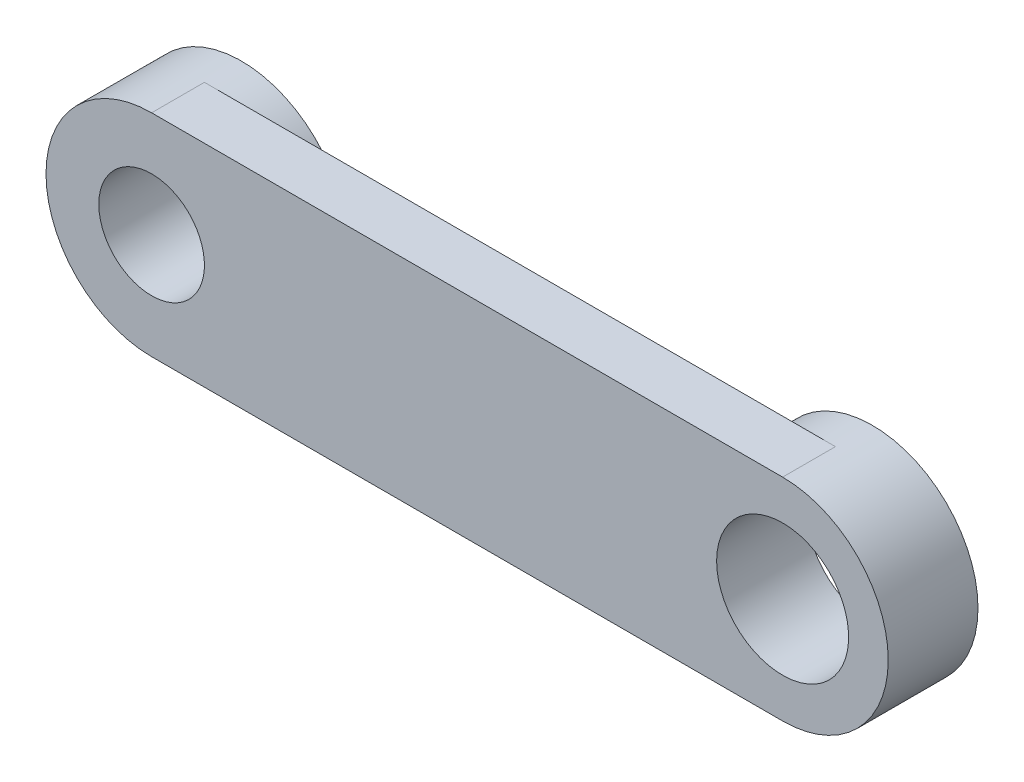
ISO-10303-21;
HEADER;
FILE_DESCRIPTION(('STEP AP214'),'2;1');
FILE_NAME('part.step','',(''),(''),'','','');
FILE_SCHEMA(('AUTOMOTIVE_DESIGN { 1 0 10303 214 1 1 1 1 }'));
ENDSEC;
DATA;
#1=APPLICATION_CONTEXT('core data for automotive mechanical design processes');
#2=APPLICATION_PROTOCOL_DEFINITION('international standard','automotive_design',2000,#1);
#3=PRODUCT_CONTEXT('',#1,'mechanical');
#4=PRODUCT('Part','Part','',(#3));
#5=PRODUCT_RELATED_PRODUCT_CATEGORY('part','',(#4));
#6=PRODUCT_DEFINITION_FORMATION('','',#4);
#7=PRODUCT_DEFINITION_CONTEXT('part definition',#1,'design');
#8=PRODUCT_DEFINITION('design','',#6,#7);
#9=PRODUCT_DEFINITION_SHAPE('','',#8);
#10=(LENGTH_UNIT() NAMED_UNIT(*) SI_UNIT(.MILLI.,.METRE.));
#11=(NAMED_UNIT(*) PLANE_ANGLE_UNIT() SI_UNIT($,.RADIAN.));
#12=(NAMED_UNIT(*) SI_UNIT($,.STERADIAN.) SOLID_ANGLE_UNIT());
#13=UNCERTAINTY_MEASURE_WITH_UNIT(LENGTH_MEASURE(1.E-05),#10,'distance_accuracy_value','');
#14=(GEOMETRIC_REPRESENTATION_CONTEXT(3) GLOBAL_UNCERTAINTY_ASSIGNED_CONTEXT((#13)) GLOBAL_UNIT_ASSIGNED_CONTEXT((#10,
#11,#12)) REPRESENTATION_CONTEXT('',''));
#15=CARTESIAN_POINT('',(0.,0.,0.));
#16=DIRECTION('',(0.,0.,1.));
#17=DIRECTION('',(1.,0.,0.));
#18=AXIS2_PLACEMENT_3D('',#15,#16,#17);
#19=CARTESIAN_POINT('',(59.75,-20.,10.));
#20=DIRECTION('',(0.,1.,0.));
#21=DIRECTION('',(-1.,0.,0.));
#22=AXIS2_PLACEMENT_3D('',#19,#20,#21);
#23=PLANE('',#22);
#24=DIRECTION('',(1.,0.,0.));
#25=VECTOR('',#24,1.);
#26=CARTESIAN_POINT('',(59.75,-20.,0.));
#27=LINE('',#26,#25);
#28=CARTESIAN_POINT('',(-59.75,-20.,0.));
#29=VERTEX_POINT('',#28);
#30=CARTESIAN_POINT('',(59.75,-20.,0.));
#31=VERTEX_POINT('',#30);
#32=EDGE_CURVE('E102',#29,#31,#27,.T.);
#33=ORIENTED_EDGE('',*,*,#32,.T.);
#34=DIRECTION('',(0.,0.,-1.));
#35=VECTOR('',#34,1.);
#36=CARTESIAN_POINT('',(59.75,-20.,10.));
#37=LINE('',#36,#35);
#38=CARTESIAN_POINT('',(59.75,-20.,10.));
#39=VERTEX_POINT('',#38);
#40=EDGE_CURVE('E60',#39,#31,#37,.T.);
#41=ORIENTED_EDGE('',*,*,#40,.F.);
#42=DIRECTION('',(1.,0.,0.));
#43=VECTOR('',#42,1.);
#44=CARTESIAN_POINT('',(59.75,-20.,10.));
#45=LINE('',#44,#43);
#46=CARTESIAN_POINT('',(-59.75,-20.,10.));
#47=VERTEX_POINT('',#46);
#48=EDGE_CURVE('E91',#47,#39,#45,.T.);
#49=ORIENTED_EDGE('',*,*,#48,.F.);
#50=DIRECTION('',(0.,0.,-1.));
#51=VECTOR('',#50,1.);
#52=CARTESIAN_POINT('',(-59.75,-20.,10.));
#53=LINE('',#52,#51);
#54=EDGE_CURVE('E108',#47,#29,#53,.T.);
#55=ORIENTED_EDGE('',*,*,#54,.T.);
#56=EDGE_LOOP('',(#33,#41,#49,#55));
#57=FACE_BOUND('',#56,.T.);
#58=ADVANCED_FACE('F38',(#57),#23,.F.);
#59=CARTESIAN_POINT('',(59.75,20.,10.));
#60=DIRECTION('',(0.,-1.,0.));
#61=DIRECTION('',(1.,0.,0.));
#62=AXIS2_PLACEMENT_3D('',#59,#60,#61);
#63=PLANE('',#62);
#64=DIRECTION('',(-1.,0.,0.));
#65=VECTOR('',#64,1.);
#66=CARTESIAN_POINT('',(59.75,20.,0.));
#67=LINE('',#66,#65);
#68=CARTESIAN_POINT('',(59.75,20.,0.));
#69=VERTEX_POINT('',#68);
#70=CARTESIAN_POINT('',(-59.75,20.,0.));
#71=VERTEX_POINT('',#70);
#72=EDGE_CURVE('E98',#69,#71,#67,.T.);
#73=ORIENTED_EDGE('',*,*,#72,.T.);
#74=DIRECTION('',(0.,0.,-1.));
#75=VECTOR('',#74,1.);
#76=CARTESIAN_POINT('',(-59.75,20.,10.));
#77=LINE('',#76,#75);
#78=CARTESIAN_POINT('',(-59.75,20.,10.));
#79=VERTEX_POINT('',#78);
#80=EDGE_CURVE('E52',#79,#71,#77,.T.);
#81=ORIENTED_EDGE('',*,*,#80,.F.);
#82=DIRECTION('',(-1.,0.,0.));
#83=VECTOR('',#82,1.);
#84=CARTESIAN_POINT('',(59.75,20.,10.));
#85=LINE('',#84,#83);
#86=CARTESIAN_POINT('',(59.75,20.,10.));
#87=VERTEX_POINT('',#86);
#88=EDGE_CURVE('E89',#87,#79,#85,.T.);
#89=ORIENTED_EDGE('',*,*,#88,.F.);
#90=DIRECTION('',(0.,0.,-1.));
#91=VECTOR('',#90,1.);
#92=CARTESIAN_POINT('',(59.75,20.,10.));
#93=LINE('',#92,#91);
#94=EDGE_CURVE('E75',#87,#69,#93,.T.);
#95=ORIENTED_EDGE('',*,*,#94,.T.);
#96=EDGE_LOOP('',(#73,#81,#89,#95));
#97=FACE_BOUND('',#96,.T.);
#98=ADVANCED_FACE('F95',(#97),#63,.F.);
#99=CARTESIAN_POINT('',(0.,0.,10.));
#100=DIRECTION('',(0.,0.,1.));
#101=DIRECTION('',(1.,0.,0.));
#102=AXIS2_PLACEMENT_3D('',#99,#100,#101);
#103=PLANE('',#102);
#104=CARTESIAN_POINT('',(59.75,0.,10.));
#105=DIRECTION('',(0.,0.,-1.));
#106=DIRECTION('',(-1.,0.,0.));
#107=AXIS2_PLACEMENT_3D('',#104,#105,#106);
#108=CIRCLE('',#107,12.5);
#109=CARTESIAN_POINT('',(47.25,0.,10.));
#110=VERTEX_POINT('',#109);
#111=EDGE_CURVE('E93',#110,#110,#108,.T.);
#112=ORIENTED_EDGE('',*,*,#111,.T.);
#113=EDGE_LOOP('',(#112));
#114=FACE_BOUND('',#113,.T.);
#115=CARTESIAN_POINT('',(-59.75,0.,10.));
#116=DIRECTION('',(0.,0.,-1.));
#117=DIRECTION('',(-1.,0.,0.));
#118=AXIS2_PLACEMENT_3D('',#115,#116,#117);
#119=CIRCLE('',#118,9.99999999999999);
#120=CARTESIAN_POINT('',(-69.75,0.,10.));
#121=VERTEX_POINT('',#120);
#122=EDGE_CURVE('E157',#121,#121,#119,.T.);
#123=ORIENTED_EDGE('',*,*,#122,.T.);
#124=EDGE_LOOP('',(#123));
#125=FACE_BOUND('',#124,.T.);
#126=ORIENTED_EDGE('',*,*,#48,.T.);
#127=CARTESIAN_POINT('',(59.75,0.,10.));
#128=DIRECTION('',(0.,0.,1.));
#129=DIRECTION('',(1.,0.,0.));
#130=AXIS2_PLACEMENT_3D('',#127,#128,#129);
#131=CIRCLE('',#130,20.);
#132=EDGE_CURVE('E78',#39,#87,#131,.T.);
#133=ORIENTED_EDGE('',*,*,#132,.T.);
#134=ORIENTED_EDGE('',*,*,#88,.T.);
#135=CARTESIAN_POINT('',(-59.75,0.,10.));
#136=DIRECTION('',(0.,0.,1.));
#137=DIRECTION('',(1.,0.,0.));
#138=AXIS2_PLACEMENT_3D('',#135,#136,#137);
#139=CIRCLE('',#138,20.);
#140=EDGE_CURVE('E115',#79,#47,#139,.T.);
#141=ORIENTED_EDGE('',*,*,#140,.T.);
#142=EDGE_LOOP('',(#126,#133,#134,#141));
#143=FACE_BOUND('',#142,.T.);
#144=ADVANCED_FACE('F87',(#114,#125,#143),#103,.T.);
#145=CARTESIAN_POINT('',(0.,0.,0.));
#146=DIRECTION('',(0.,0.,1.));
#147=DIRECTION('',(1.,0.,0.));
#148=AXIS2_PLACEMENT_3D('',#145,#146,#147);
#149=PLANE('',#148);
#150=ORIENTED_EDGE('',*,*,#72,.F.);
#151=CARTESIAN_POINT('',(59.75,0.,0.));
#152=DIRECTION('',(0.,0.,1.));
#153=DIRECTION('',(1.,0.,0.));
#154=AXIS2_PLACEMENT_3D('',#151,#152,#153);
#155=CIRCLE('',#154,20.);
#156=EDGE_CURVE('E11',#69,#31,#155,.T.);
#157=ORIENTED_EDGE('',*,*,#156,.T.);
#158=ORIENTED_EDGE('',*,*,#32,.F.);
#159=CARTESIAN_POINT('',(-59.75,0.,0.));
#160=DIRECTION('',(0.,0.,1.));
#161=DIRECTION('',(1.,0.,0.));
#162=AXIS2_PLACEMENT_3D('',#159,#160,#161);
#163=CIRCLE('',#162,20.);
#164=EDGE_CURVE('E45',#29,#71,#163,.T.);
#165=ORIENTED_EDGE('',*,*,#164,.T.);
#166=EDGE_LOOP('',(#150,#157,#158,#165));
#167=FACE_BOUND('',#166,.T.);
#168=ADVANCED_FACE('F112',(#167),#149,.F.);
#169=CARTESIAN_POINT('',(-59.75,0.,-7.));
#170=DIRECTION('',(0.,0.,1.));
#171=DIRECTION('',(1.,0.,0.));
#172=AXIS2_PLACEMENT_3D('',#169,#170,#171);
#173=CYLINDRICAL_SURFACE('',#172,20.);
#174=ORIENTED_EDGE('',*,*,#164,.F.);
#175=ORIENTED_EDGE('',*,*,#54,.F.);
#176=ORIENTED_EDGE('',*,*,#140,.F.);
#177=ORIENTED_EDGE('',*,*,#80,.T.);
#178=EDGE_LOOP('',(#174,#175,#176,#177));
#179=FACE_BOUND('',#178,.T.);
#180=CARTESIAN_POINT('',(-59.75,0.,-7.));
#181=DIRECTION('',(0.,0.,1.));
#182=DIRECTION('',(1.,0.,0.));
#183=AXIS2_PLACEMENT_3D('',#180,#181,#182);
#184=CIRCLE('',#183,20.);
#185=CARTESIAN_POINT('',(-39.75,0.,-7.));
#186=VERTEX_POINT('',#185);
#187=EDGE_CURVE('E105',#186,#186,#184,.T.);
#188=ORIENTED_EDGE('',*,*,#187,.T.);
#189=EDGE_LOOP('',(#188));
#190=FACE_BOUND('',#189,.T.);
#191=ADVANCED_FACE('F113',(#179,#190),#173,.T.);
#192=CARTESIAN_POINT('',(-59.75,0.,-7.));
#193=DIRECTION('',(0.,0.,1.));
#194=DIRECTION('',(1.,0.,0.));
#195=AXIS2_PLACEMENT_3D('',#192,#193,#194);
#196=PLANE('',#195);
#197=CARTESIAN_POINT('',(-59.75,0.,-7.));
#198=DIRECTION('',(0.,0.,-1.));
#199=DIRECTION('',(-1.,0.,0.));
#200=AXIS2_PLACEMENT_3D('',#197,#198,#199);
#201=CIRCLE('',#200,9.99999999999999);
#202=CARTESIAN_POINT('',(-69.75,0.,-7.));
#203=VERTEX_POINT('',#202);
#204=EDGE_CURVE('E161',#203,#203,#201,.T.);
#205=ORIENTED_EDGE('',*,*,#204,.F.);
#206=EDGE_LOOP('',(#205));
#207=FACE_BOUND('',#206,.T.);
#208=ORIENTED_EDGE('',*,*,#187,.F.);
#209=EDGE_LOOP('',(#208));
#210=FACE_BOUND('',#209,.T.);
#211=ADVANCED_FACE('F131',(#207,#210),#196,.F.);
#212=CARTESIAN_POINT('',(59.75,0.,-7.));
#213=DIRECTION('',(0.,0.,1.));
#214=DIRECTION('',(1.,0.,0.));
#215=AXIS2_PLACEMENT_3D('',#212,#213,#214);
#216=CYLINDRICAL_SURFACE('',#215,20.);
#217=CARTESIAN_POINT('',(59.75,0.,-7.));
#218=DIRECTION('',(0.,0.,1.));
#219=DIRECTION('',(1.,0.,0.));
#220=AXIS2_PLACEMENT_3D('',#217,#218,#219);
#221=CIRCLE('',#220,20.);
#222=CARTESIAN_POINT('',(79.75,0.,-7.));
#223=VERTEX_POINT('',#222);
#224=EDGE_CURVE('E92',#223,#223,#221,.T.);
#225=ORIENTED_EDGE('',*,*,#224,.T.);
#226=EDGE_LOOP('',(#225));
#227=FACE_BOUND('',#226,.T.);
#228=ORIENTED_EDGE('',*,*,#40,.T.);
#229=ORIENTED_EDGE('',*,*,#156,.F.);
#230=ORIENTED_EDGE('',*,*,#94,.F.);
#231=ORIENTED_EDGE('',*,*,#132,.F.);
#232=EDGE_LOOP('',(#228,#229,#230,#231));
#233=FACE_BOUND('',#232,.T.);
#234=ADVANCED_FACE('F77',(#227,#233),#216,.T.);
#235=CARTESIAN_POINT('',(59.75,0.,-7.));
#236=DIRECTION('',(0.,0.,1.));
#237=DIRECTION('',(1.,0.,0.));
#238=AXIS2_PLACEMENT_3D('',#235,#236,#237);
#239=PLANE('',#238);
#240=CARTESIAN_POINT('',(59.75,0.,-7.));
#241=DIRECTION('',(0.,0.,-1.));
#242=DIRECTION('',(-1.,0.,0.));
#243=AXIS2_PLACEMENT_3D('',#240,#241,#242);
#244=CIRCLE('',#243,12.5);
#245=CARTESIAN_POINT('',(47.25,0.,-7.));
#246=VERTEX_POINT('',#245);
#247=EDGE_CURVE('E156',#246,#246,#244,.T.);
#248=ORIENTED_EDGE('',*,*,#247,.F.);
#249=EDGE_LOOP('',(#248));
#250=FACE_BOUND('',#249,.T.);
#251=ORIENTED_EDGE('',*,*,#224,.F.);
#252=EDGE_LOOP('',(#251));
#253=FACE_BOUND('',#252,.T.);
#254=ADVANCED_FACE('F137',(#250,#253),#239,.F.);
#255=CARTESIAN_POINT('',(59.75,0.,10.));
#256=DIRECTION('',(0.,0.,-1.));
#257=DIRECTION('',(-1.,0.,0.));
#258=AXIS2_PLACEMENT_3D('',#255,#256,#257);
#259=CYLINDRICAL_SURFACE('',#258,12.5);
#260=ORIENTED_EDGE('',*,*,#111,.F.);
#261=EDGE_LOOP('',(#260));
#262=FACE_BOUND('',#261,.T.);
#263=ORIENTED_EDGE('',*,*,#247,.T.);
#264=EDGE_LOOP('',(#263));
#265=FACE_BOUND('',#264,.T.);
#266=ADVANCED_FACE('F141',(#262,#265),#259,.F.);
#267=CARTESIAN_POINT('',(-59.75,0.,10.));
#268=DIRECTION('',(0.,0.,-1.));
#269=DIRECTION('',(-1.,0.,0.));
#270=AXIS2_PLACEMENT_3D('',#267,#268,#269);
#271=CYLINDRICAL_SURFACE('',#270,9.99999999999999);
#272=ORIENTED_EDGE('',*,*,#122,.F.);
#273=EDGE_LOOP('',(#272));
#274=FACE_BOUND('',#273,.T.);
#275=ORIENTED_EDGE('',*,*,#204,.T.);
#276=EDGE_LOOP('',(#275));
#277=FACE_BOUND('',#276,.T.);
#278=ADVANCED_FACE('F143',(#274,#277),#271,.F.);
#279=CLOSED_SHELL('',(#58,#98,#144,#168,#191,#211,#234,#254,#266,#278));
#280=MANIFOLD_SOLID_BREP('B2',#279);
#281=ADVANCED_BREP_SHAPE_REPRESENTATION('',(#18,#280),#14);
#282=SHAPE_DEFINITION_REPRESENTATION(#9,#281);
ENDSEC;
END-ISO-10303-21;
